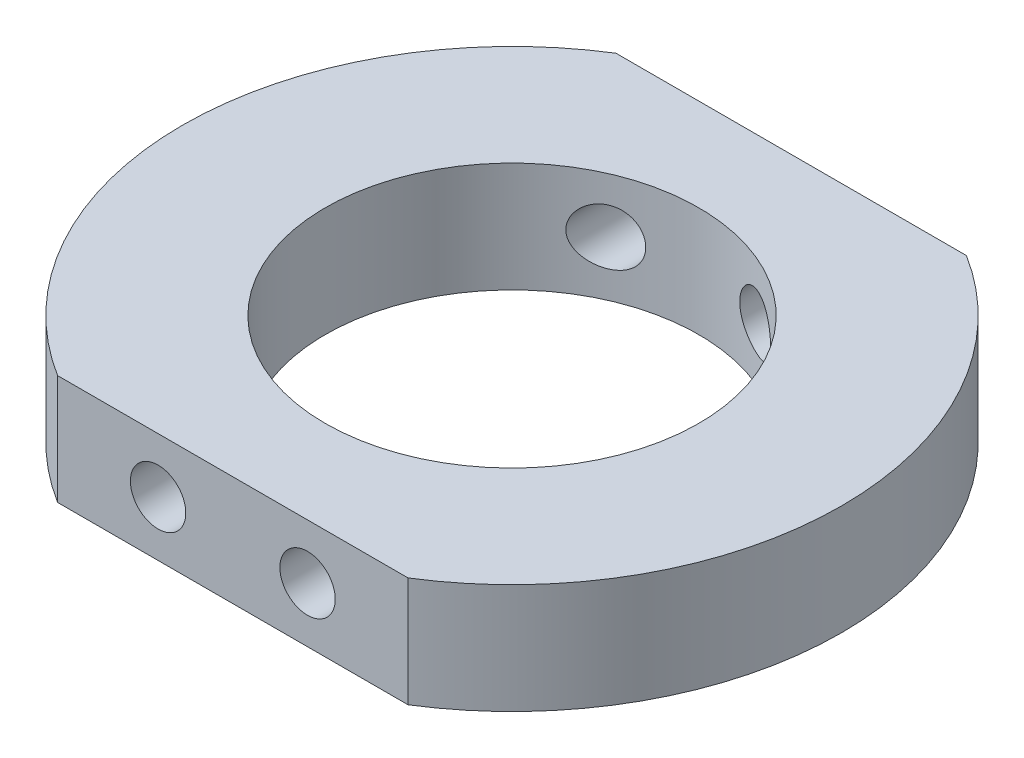
ISO-10303-21;
HEADER;
FILE_DESCRIPTION(('STEP AP214'),'2;1');
FILE_NAME('part.step','',(''),(''),'','','');
FILE_SCHEMA(('AUTOMOTIVE_DESIGN { 1 0 10303 214 1 1 1 1 }'));
ENDSEC;
DATA;
#1=APPLICATION_CONTEXT('core data for automotive mechanical design processes');
#2=APPLICATION_PROTOCOL_DEFINITION('international standard','automotive_design',2000,#1);
#3=PRODUCT_CONTEXT('',#1,'mechanical');
#4=PRODUCT('Part','Part','',(#3));
#5=PRODUCT_RELATED_PRODUCT_CATEGORY('part','',(#4));
#6=PRODUCT_DEFINITION_FORMATION('','',#4);
#7=PRODUCT_DEFINITION_CONTEXT('part definition',#1,'design');
#8=PRODUCT_DEFINITION('design','',#6,#7);
#9=PRODUCT_DEFINITION_SHAPE('','',#8);
#10=(LENGTH_UNIT() NAMED_UNIT(*) SI_UNIT(.MILLI.,.METRE.));
#11=(NAMED_UNIT(*) PLANE_ANGLE_UNIT() SI_UNIT($,.RADIAN.));
#12=(NAMED_UNIT(*) SI_UNIT($,.STERADIAN.) SOLID_ANGLE_UNIT());
#13=UNCERTAINTY_MEASURE_WITH_UNIT(LENGTH_MEASURE(1.E-05),#10,'distance_accuracy_value','');
#14=(GEOMETRIC_REPRESENTATION_CONTEXT(3) GLOBAL_UNCERTAINTY_ASSIGNED_CONTEXT((#13)) GLOBAL_UNIT_ASSIGNED_CONTEXT((#10,
#11,#12)) REPRESENTATION_CONTEXT('',''));
#15=CARTESIAN_POINT('',(0.,0.,0.));
#16=DIRECTION('',(0.,0.,1.));
#17=DIRECTION('',(1.,0.,0.));
#18=AXIS2_PLACEMENT_3D('',#15,#16,#17);
#19=CARTESIAN_POINT('',(0.,-12.7,0.));
#20=DIRECTION('',(0.,1.,0.));
#21=DIRECTION('',(0.,0.,1.));
#22=AXIS2_PLACEMENT_3D('',#19,#20,#21);
#23=CYLINDRICAL_SURFACE('',#22,38.1);
#24=DIRECTION('',(0.,-1.,0.));
#25=VECTOR('',#24,1.);
#26=CARTESIAN_POINT('',(-20.2570864044653,130.620306710814,32.26856752944));
#27=LINE('',#26,#25);
#28=CARTESIAN_POINT('',(-20.2570864044653,0.,32.26856752944));
#29=VERTEX_POINT('',#28);
#30=CARTESIAN_POINT('',(-20.2570864044653,-12.7,32.26856752944));
#31=VERTEX_POINT('',#30);
#32=EDGE_CURVE('E93',#29,#31,#27,.T.);
#33=ORIENTED_EDGE('',*,*,#32,.F.);
#34=CARTESIAN_POINT('',(0.,0.,0.));
#35=DIRECTION('',(0.,1.,0.));
#36=DIRECTION('',(0.,0.,1.));
#37=AXIS2_PLACEMENT_3D('',#34,#35,#36);
#38=CIRCLE('',#37,38.1);
#39=CARTESIAN_POINT('',(-20.2570864044653,0.,-32.26856752944));
#40=VERTEX_POINT('',#39);
#41=EDGE_CURVE('E82',#40,#29,#38,.T.);
#42=ORIENTED_EDGE('',*,*,#41,.F.);
#43=DIRECTION('',(0.,-1.,0.));
#44=VECTOR('',#43,1.);
#45=CARTESIAN_POINT('',(-20.2570864044653,151.511059456916,-32.26856752944));
#46=LINE('',#45,#44);
#47=CARTESIAN_POINT('',(-20.2570864044653,-12.7,-32.26856752944));
#48=VERTEX_POINT('',#47);
#49=EDGE_CURVE('E100',#40,#48,#46,.T.);
#50=ORIENTED_EDGE('',*,*,#49,.T.);
#51=CARTESIAN_POINT('',(0.,-12.7,0.));
#52=DIRECTION('',(0.,1.,0.));
#53=DIRECTION('',(0.,0.,1.));
#54=AXIS2_PLACEMENT_3D('',#51,#52,#53);
#55=CIRCLE('',#54,38.1);
#56=EDGE_CURVE('E94',#48,#31,#55,.T.);
#57=ORIENTED_EDGE('',*,*,#56,.T.);
#58=EDGE_LOOP('',(#33,#42,#50,#57));
#59=FACE_BOUND('',#58,.T.);
#60=ADVANCED_FACE('F33',(#59),#23,.T.);
#61=DIRECTION('',(0.,-1.,0.));
#62=VECTOR('',#61,1.);
#63=CARTESIAN_POINT('',(20.2570864044653,130.620306710814,32.26856752944));
#64=LINE('',#63,#62);
#65=CARTESIAN_POINT('',(20.2570864044653,0.,32.26856752944));
#66=VERTEX_POINT('',#65);
#67=CARTESIAN_POINT('',(20.2570864044653,-12.7,32.26856752944));
#68=VERTEX_POINT('',#67);
#69=EDGE_CURVE('E54',#66,#68,#64,.T.);
#70=ORIENTED_EDGE('',*,*,#69,.T.);
#71=CARTESIAN_POINT('',(20.2570864044653,-12.7,-32.26856752944));
#72=VERTEX_POINT('',#71);
#73=EDGE_CURVE('E89',#68,#72,#55,.T.);
#74=ORIENTED_EDGE('',*,*,#73,.T.);
#75=DIRECTION('',(0.,-1.,0.));
#76=VECTOR('',#75,1.);
#77=CARTESIAN_POINT('',(20.2570864044653,151.511059456916,-32.26856752944));
#78=LINE('',#77,#76);
#79=CARTESIAN_POINT('',(20.2570864044653,0.,-32.26856752944));
#80=VERTEX_POINT('',#79);
#81=EDGE_CURVE('E106',#80,#72,#78,.T.);
#82=ORIENTED_EDGE('',*,*,#81,.F.);
#83=EDGE_CURVE('E90',#66,#80,#38,.T.);
#84=ORIENTED_EDGE('',*,*,#83,.F.);
#85=EDGE_LOOP('',(#70,#74,#82,#84));
#86=FACE_BOUND('',#85,.T.);
#87=ADVANCED_FACE('F35',(#86),#23,.T.);
#88=CARTESIAN_POINT('',(0.,-12.7,0.));
#89=DIRECTION('',(0.,1.,0.));
#90=DIRECTION('',(0.,0.,1.));
#91=AXIS2_PLACEMENT_3D('',#88,#89,#90);
#92=PLANE('',#91);
#93=CARTESIAN_POINT('',(0.,-12.7,0.));
#94=DIRECTION('',(0.,1.,0.));
#95=DIRECTION('',(0.,0.,1.));
#96=AXIS2_PLACEMENT_3D('',#93,#94,#95);
#97=CIRCLE('',#96,21.59);
#98=CARTESIAN_POINT('',(0.,-12.7,21.59));
#99=VERTEX_POINT('',#98);
#100=EDGE_CURVE('E113',#99,#99,#97,.T.);
#101=ORIENTED_EDGE('',*,*,#100,.T.);
#102=EDGE_LOOP('',(#101));
#103=FACE_BOUND('',#102,.T.);
#104=ORIENTED_EDGE('',*,*,#73,.F.);
#105=DIRECTION('',(-1.,0.,0.));
#106=VECTOR('',#105,1.);
#107=CARTESIAN_POINT('',(0.,-12.7,32.26856752944));
#108=LINE('',#107,#106);
#109=EDGE_CURVE('E61',#68,#31,#108,.T.);
#110=ORIENTED_EDGE('',*,*,#109,.T.);
#111=ORIENTED_EDGE('',*,*,#56,.F.);
#112=DIRECTION('',(-1.,0.,0.));
#113=VECTOR('',#112,1.);
#114=CARTESIAN_POINT('',(0.,-12.7,-32.26856752944));
#115=LINE('',#114,#113);
#116=EDGE_CURVE('E109',#72,#48,#115,.T.);
#117=ORIENTED_EDGE('',*,*,#116,.F.);
#118=EDGE_LOOP('',(#104,#110,#111,#117));
#119=FACE_BOUND('',#118,.T.);
#120=ADVANCED_FACE('F157',(#103,#119),#92,.F.);
#121=CARTESIAN_POINT('',(0.,0.,0.));
#122=DIRECTION('',(0.,1.,0.));
#123=DIRECTION('',(0.,0.,1.));
#124=AXIS2_PLACEMENT_3D('',#121,#122,#123);
#125=PLANE('',#124);
#126=DIRECTION('',(-1.,0.,0.));
#127=VECTOR('',#126,1.);
#128=CARTESIAN_POINT('',(0.,0.,32.26856752944));
#129=LINE('',#128,#127);
#130=EDGE_CURVE('E11',#66,#29,#129,.T.);
#131=ORIENTED_EDGE('',*,*,#130,.F.);
#132=ORIENTED_EDGE('',*,*,#83,.T.);
#133=DIRECTION('',(-1.,0.,0.));
#134=VECTOR('',#133,1.);
#135=CARTESIAN_POINT('',(0.,0.,-32.26856752944));
#136=LINE('',#135,#134);
#137=EDGE_CURVE('E46',#80,#40,#136,.T.);
#138=ORIENTED_EDGE('',*,*,#137,.T.);
#139=ORIENTED_EDGE('',*,*,#41,.T.);
#140=EDGE_LOOP('',(#131,#132,#138,#139));
#141=FACE_BOUND('',#140,.T.);
#142=CARTESIAN_POINT('',(0.,0.,0.));
#143=DIRECTION('',(0.,1.,0.));
#144=DIRECTION('',(0.,0.,1.));
#145=AXIS2_PLACEMENT_3D('',#142,#143,#144);
#146=CIRCLE('',#145,21.59);
#147=CARTESIAN_POINT('',(0.,0.,21.59));
#148=VERTEX_POINT('',#147);
#149=EDGE_CURVE('E112',#148,#148,#146,.T.);
#150=ORIENTED_EDGE('',*,*,#149,.F.);
#151=EDGE_LOOP('',(#150));
#152=FACE_BOUND('',#151,.T.);
#153=ADVANCED_FACE('F84',(#141,#152),#125,.T.);
#154=CARTESIAN_POINT('',(0.,-12.7,0.));
#155=DIRECTION('',(0.,1.,0.));
#156=DIRECTION('',(0.,0.,1.));
#157=AXIS2_PLACEMENT_3D('',#154,#155,#156);
#158=CYLINDRICAL_SURFACE('',#157,21.59);
#159=CARTESIAN_POINT('',(5.43600000000001,-6.34999999999999,20.8944491193235));
#160=CARTESIAN_POINT('',(5.43600417780634,-6.52482596937976,20.8944491154701));
#161=CARTESIAN_POINT('',(5.45037366845655,-6.6997006480542,20.8907257060151));
#162=CARTESIAN_POINT('',(5.50738536340505,-7.04450288420994,20.8757670500161));
#163=CARTESIAN_POINT('',(5.55004079151525,-7.21442808898149,20.8645282899888));
#164=CARTESIAN_POINT('',(5.66214589768096,-7.54437317713616,20.8343838021955));
#165=CARTESIAN_POINT('',(5.73158131008773,-7.7043982817078,20.8154821561613));
#166=CARTESIAN_POINT('',(5.89487067879206,-8.01019748780447,20.7698279206782));
#167=CARTESIAN_POINT('',(5.98872226280105,-8.15597297193842,20.7430760939249));
#168=CARTESIAN_POINT('',(6.19849948868073,-8.4305462889237,20.6813614531156));
#169=CARTESIAN_POINT('',(6.31459251902632,-8.5592019665734,20.6463358727392));
#170=CARTESIAN_POINT('',(6.56448035010738,-8.7950639503519,20.5682474936521));
#171=CARTESIAN_POINT('',(6.69827678490989,-8.90226827417129,20.5251839528674));
#172=CARTESIAN_POINT('',(6.98333036662958,-9.09575991422694,20.4299871658724));
#173=CARTESIAN_POINT('',(7.13497741407984,-9.18136141365573,20.3776297743892));
#174=CARTESIAN_POINT('',(7.44775387775961,-9.32620553191144,20.2654058907837));
#175=CARTESIAN_POINT('',(7.60888539693771,-9.38544227988597,20.2055377299783));
#176=CARTESIAN_POINT('',(7.94499443792837,-9.47963256989106,20.0758389689565));
#177=CARTESIAN_POINT('',(8.12024868686611,-9.51309273914612,20.0056439136619));
#178=CARTESIAN_POINT('',(8.47146917439829,-9.55064957455914,19.8594698883063));
#179=CARTESIAN_POINT('',(8.64743563000311,-9.55473649095916,19.783489006233));
#180=CARTESIAN_POINT('',(9.00890120200095,-9.53372605557204,19.6216675944265));
#181=CARTESIAN_POINT('',(9.19413287605025,-9.5064300655315,19.5355143187991));
#182=CARTESIAN_POINT('',(9.55612779008722,-9.42050701733502,19.3610166962491));
#183=CARTESIAN_POINT('',(9.73288759597724,-9.36186736903497,19.2726714824746));
#184=CARTESIAN_POINT('',(10.0844372786669,-9.21022338525305,19.0911939329139));
#185=CARTESIAN_POINT('',(10.2584366956494,-9.11532654199217,18.9981015275552));
#186=CARTESIAN_POINT('',(10.587735293349,-8.89365590847077,18.8165717292371));
#187=CARTESIAN_POINT('',(10.7430245061968,-8.76686523684641,18.7281368315643));
#188=CARTESIAN_POINT('',(11.0279631507548,-8.48496070834382,18.5617612823802));
#189=CARTESIAN_POINT('',(11.1579154323967,-8.33023031218161,18.4837007544417));
#190=CARTESIAN_POINT('',(11.3308055492155,-8.07869652770348,18.3778551126074));
#191=CARTESIAN_POINT('',(11.384750903408,-7.99163845279961,18.3444549514799));
#192=CARTESIAN_POINT('',(11.4845953217266,-7.81153979538842,18.2821119535612));
#193=CARTESIAN_POINT('',(11.5304974814347,-7.71850153340119,18.253167402464));
#194=CARTESIAN_POINT('',(11.6329130764522,-7.482226949835,18.1881465521369));
#195=CARTESIAN_POINT('',(11.684332535183,-7.33588282284909,18.1550760816621));
#196=CARTESIAN_POINT('',(11.765678329395,-7.03509945748044,18.1024664500555));
#197=CARTESIAN_POINT('',(11.795621890485,-6.88066681375318,18.0829164447406));
#198=CARTESIAN_POINT('',(11.8325070416882,-6.5674141322516,18.0588035377497));
#199=CARTESIAN_POINT('',(11.8393809127862,-6.4085825552596,18.0542847592415));
#200=CARTESIAN_POINT('',(11.8295105936855,-6.09197057244107,18.0607533115446));
#201=CARTESIAN_POINT('',(11.8127646977574,-5.93419024335841,18.0717417622288));
#202=CARTESIAN_POINT('',(11.7579385756479,-5.63161997873859,18.1074560331308));
#203=CARTESIAN_POINT('',(11.7208686525018,-5.48656592682501,18.131530880309));
#204=CARTESIAN_POINT('',(11.6278900564448,-5.20520012244584,18.1912975717315));
#205=CARTESIAN_POINT('',(11.5719774484099,-5.06889020319717,18.2269918425341));
#206=CARTESIAN_POINT('',(11.4388922151172,-4.79818139539521,18.310828327537));
#207=CARTESIAN_POINT('',(11.3604890466551,-4.66461002915091,18.3596760379755));
#208=CARTESIAN_POINT('',(11.1872449467372,-4.41232071121577,18.4657512068329));
#209=CARTESIAN_POINT('',(11.092396133222,-4.29360992909252,18.5229826813675));
#210=CARTESIAN_POINT('',(10.8738944862463,-4.05620472782372,18.6522074482564));
#211=CARTESIAN_POINT('',(10.7480585338664,-3.9400289264887,18.725136810315));
#212=CARTESIAN_POINT('',(10.481351876958,-3.73016959824794,18.8757213401557));
#213=CARTESIAN_POINT('',(10.340472302794,-3.63649944749572,18.9533792841584));
#214=CARTESIAN_POINT('',(10.0272999306964,-3.46201168646769,19.1211097486895));
#215=CARTESIAN_POINT('',(9.85331172923941,-3.38449935632699,19.2114728866697));
#216=CARTESIAN_POINT('',(9.49402630644148,-3.26133083667146,19.3915439767138));
#217=CARTESIAN_POINT('',(9.30872490356916,-3.2156865045228,19.4812516726309));
#218=CARTESIAN_POINT('',(8.92266129675864,-3.1566242336165,19.6611682937924));
#219=CARTESIAN_POINT('',(8.72157928129248,-3.14476798846862,19.7512141185316));
#220=CARTESIAN_POINT('',(8.31787716572879,-3.15945813178383,19.9245886333873));
#221=CARTESIAN_POINT('',(8.115257443718,-3.18599536622722,20.0079189196651));
#222=CARTESIAN_POINT('',(7.72454482762245,-3.27630498157734,20.1618851071454));
#223=CARTESIAN_POINT('',(7.53621028832938,-3.33832972791751,20.232925894426));
#224=CARTESIAN_POINT('',(7.17144668539682,-3.4978707432832,20.3650694550607));
#225=CARTESIAN_POINT('',(6.99501123208472,-3.59536778129231,20.426177587402));
#226=CARTESIAN_POINT('',(6.67457281089339,-3.81475032223974,20.533010008017));
#227=CARTESIAN_POINT('',(6.52910843459815,-3.93409736428109,20.5795687176993));
#228=CARTESIAN_POINT('',(6.26005013874862,-4.19817532713636,20.66300422602));
#229=CARTESIAN_POINT('',(6.13645041628741,-4.34289949246416,20.6998835948284));
#230=CARTESIAN_POINT('',(5.92269620783175,-4.64411187169164,20.7620196750023));
#231=CARTESIAN_POINT('',(5.83098645847216,-4.79938335484911,20.787838471236));
#232=CARTESIAN_POINT('',(5.67468251817591,-5.12403122564159,20.8310512464887));
#233=CARTESIAN_POINT('',(5.61006939488896,-5.29339766567246,20.8484511091087));
#234=CARTESIAN_POINT('',(5.51911065791479,-5.61028011453921,20.8726927398643));
#235=CARTESIAN_POINT('',(5.48801425387791,-5.75635334242572,20.8808586577946));
#236=CARTESIAN_POINT('',(5.44645756752342,-6.05160597135345,20.8917367367189));
#237=CARTESIAN_POINT('',(5.43599643422341,-6.2007852440474,20.8944491226124));
#238=CARTESIAN_POINT('',(5.43600000000001,-6.34999999999999,20.8944491193235));
#239=B_SPLINE_CURVE_WITH_KNOTS('',3,(#159,#160,#161,#162,#163,#164,#165,#166,#167,#168,#169,
#170,#171,#172,#173,#174,#175,#176,#177,#178,#179,#180,#181,#182,#183,#184,#185,#186,#187,#188,
#189,#190,#191,#192,#193,#194,#195,#196,#197,#198,#199,#200,#201,#202,#203,#204,#205,#206,#207,
#208,#209,#210,#211,#212,#213,#214,#215,#216,#217,#218,#219,#220,#221,#222,#223,#224,#225,#226,
#227,#228,#229,#230,#231,#232,#233,#234,#235,#236,#237,#238),.UNSPECIFIED.,.T.,.F.,(4,2,2,2,2,2,
2,2,2,2,2,2,2,2,2,2,2,2,2,2,2,2,2,2,2,2,2,2,2,2,2,2,2,2,2,2,2,2,2,4),(0.,0.523938640379537,
1.04812239744396,1.57202730759138,2.09588133384991,2.62384482954108,3.15185709157869,
3.69496858232957,4.23820095167353,4.81093323916628,5.383855622847,5.99949393140518,
6.61537971606089,7.2691621966788,7.92329145438625,8.56904473793747,8.89174655910963,
9.21432390801494,9.68793103962874,10.1611578694342,10.6357726050331,11.1104216172495,
11.5633718935781,12.0164168231484,12.5017279414534,12.9872723056178,13.5435069135968,
14.1000713043413,14.7297556478627,15.3596741581025,16.0182695007998,16.6767078428461,
17.3052122052548,17.9333763355998,18.5118635251372,19.0901969523407,19.6340316164917,
20.1774856689801,20.6246881120286,21.0718721124132),.UNSPECIFIED.);
#240=CARTESIAN_POINT('',(5.43600000000001,-6.34999999999999,20.8944491193235));
#241=VERTEX_POINT('',#240);
#242=EDGE_CURVE('E37',#241,#241,#239,.T.);
#243=ORIENTED_EDGE('',*,*,#242,.T.);
#244=EDGE_LOOP('',(#243));
#245=FACE_BOUND('',#244,.T.);
#246=CARTESIAN_POINT('',(5.43600000000001,-6.34999999999999,-20.8944491193235));
#247=CARTESIAN_POINT('',(5.43600417780634,-6.17517403062023,-20.8944491154701));
#248=CARTESIAN_POINT('',(5.45037366845655,-6.00029935194579,-20.8907257060151));
#249=CARTESIAN_POINT('',(5.50738536340505,-5.65549711579005,-20.8757670500161));
#250=CARTESIAN_POINT('',(5.55004079151525,-5.4855719110185,-20.8645282899888));
#251=CARTESIAN_POINT('',(5.66214589768096,-5.15562682286383,-20.8343838021955));
#252=CARTESIAN_POINT('',(5.73158131008773,-4.99560171829219,-20.8154821561613));
#253=CARTESIAN_POINT('',(5.89487067879206,-4.68980251219552,-20.7698279206782));
#254=CARTESIAN_POINT('',(5.98872226280105,-4.54402702806157,-20.7430760939249));
#255=CARTESIAN_POINT('',(6.19849948868073,-4.2694537110763,-20.6813614531156));
#256=CARTESIAN_POINT('',(6.31459251902631,-4.14079803342659,-20.6463358727392));
#257=CARTESIAN_POINT('',(6.56448035010738,-3.90493604964809,-20.5682474936521));
#258=CARTESIAN_POINT('',(6.69827678490989,-3.7977317258287,-20.5251839528674));
#259=CARTESIAN_POINT('',(6.98333036662958,-3.60424008577305,-20.4299871658724));
#260=CARTESIAN_POINT('',(7.13497741407984,-3.51863858634426,-20.3776297743892));
#261=CARTESIAN_POINT('',(7.44775387775961,-3.37379446808855,-20.2654058907837));
#262=CARTESIAN_POINT('',(7.60888539693771,-3.31455772011402,-20.2055377299783));
#263=CARTESIAN_POINT('',(7.94499443792837,-3.22036743010893,-20.0758389689565));
#264=CARTESIAN_POINT('',(8.12024868686611,-3.18690726085387,-20.0056439136619));
#265=CARTESIAN_POINT('',(8.47146917439829,-3.14935042544085,-19.8594698883063));
#266=CARTESIAN_POINT('',(8.64743563000311,-3.14526350904082,-19.783489006233));
#267=CARTESIAN_POINT('',(9.00890120200094,-3.16627394442795,-19.6216675944265));
#268=CARTESIAN_POINT('',(9.19413287605025,-3.19356993446849,-19.5355143187991));
#269=CARTESIAN_POINT('',(9.55612779008722,-3.27949298266497,-19.3610166962491));
#270=CARTESIAN_POINT('',(9.73288759597724,-3.33813263096502,-19.2726714824746));
#271=CARTESIAN_POINT('',(10.0844372786669,-3.48977661474694,-19.0911939329139));
#272=CARTESIAN_POINT('',(10.2584366956494,-3.58467345800782,-18.9981015275552));
#273=CARTESIAN_POINT('',(10.587735293349,-3.80634409152922,-18.8165717292371));
#274=CARTESIAN_POINT('',(10.7430245061968,-3.93313476315358,-18.7281368315643));
#275=CARTESIAN_POINT('',(11.0279631507548,-4.21503929165617,-18.5617612823802));
#276=CARTESIAN_POINT('',(11.1579154323967,-4.36976968781839,-18.4837007544417));
#277=CARTESIAN_POINT('',(11.3308055492155,-4.62130347229651,-18.3778551126074));
#278=CARTESIAN_POINT('',(11.384750903408,-4.70836154720038,-18.3444549514799));
#279=CARTESIAN_POINT('',(11.4845953217266,-4.88846020461157,-18.2821119535612));
#280=CARTESIAN_POINT('',(11.5304974814347,-4.9814984665988,-18.253167402464));
#281=CARTESIAN_POINT('',(11.6329130764522,-5.21777305016499,-18.1881465521369));
#282=CARTESIAN_POINT('',(11.684332535183,-5.3641171771509,-18.1550760816621));
#283=CARTESIAN_POINT('',(11.765678329395,-5.66490054251954,-18.1024664500554));
#284=CARTESIAN_POINT('',(11.795621890485,-5.81933318624681,-18.0829164447406));
#285=CARTESIAN_POINT('',(11.8325070416882,-6.13258586774839,-18.0588035377497));
#286=CARTESIAN_POINT('',(11.8393809127862,-6.29141744474039,-18.0542847592415));
#287=CARTESIAN_POINT('',(11.8295105936855,-6.60802942755891,-18.0607533115446));
#288=CARTESIAN_POINT('',(11.8127646977574,-6.76580975664157,-18.0717417622288));
#289=CARTESIAN_POINT('',(11.7579385756479,-7.06838002126139,-18.1074560331308));
#290=CARTESIAN_POINT('',(11.7208686525018,-7.21343407317497,-18.131530880309));
#291=CARTESIAN_POINT('',(11.6278900564449,-7.49479987755415,-18.1912975717315));
#292=CARTESIAN_POINT('',(11.5719774484099,-7.63110979680281,-18.2269918425341));
#293=CARTESIAN_POINT('',(11.4388922151172,-7.90181860460478,-18.310828327537));
#294=CARTESIAN_POINT('',(11.3604890466551,-8.03538997084908,-18.3596760379755));
#295=CARTESIAN_POINT('',(11.1872449467372,-8.28767928878422,-18.4657512068328));
#296=CARTESIAN_POINT('',(11.092396133222,-8.40639007090746,-18.5229826813675));
#297=CARTESIAN_POINT('',(10.8738944862463,-8.64379527217627,-18.6522074482564));
#298=CARTESIAN_POINT('',(10.7480585338664,-8.75997107351129,-18.725136810315));
#299=CARTESIAN_POINT('',(10.481351876958,-8.96983040175204,-18.8757213401557));
#300=CARTESIAN_POINT('',(10.340472302794,-9.06350055250427,-18.9533792841584));
#301=CARTESIAN_POINT('',(10.0272999306964,-9.23798831353229,-19.1211097486895));
#302=CARTESIAN_POINT('',(9.85331172923942,-9.315500643673,-19.2114728866697));
#303=CARTESIAN_POINT('',(9.49402630644148,-9.43866916332853,-19.3915439767138));
#304=CARTESIAN_POINT('',(9.30872490356916,-9.48431349547719,-19.4812516726309));
#305=CARTESIAN_POINT('',(8.92266129675864,-9.54337576638349,-19.6611682937924));
#306=CARTESIAN_POINT('',(8.72157928129249,-9.55523201153136,-19.7512141185316));
#307=CARTESIAN_POINT('',(8.3178771657288,-9.54054186821616,-19.9245886333873));
#308=CARTESIAN_POINT('',(8.11525744371801,-9.51400463377277,-20.0079189196651));
#309=CARTESIAN_POINT('',(7.72454482762246,-9.42369501842265,-20.1618851071454));
#310=CARTESIAN_POINT('',(7.53621028832938,-9.36167027208249,-20.2329258944259));
#311=CARTESIAN_POINT('',(7.17144668539682,-9.20212925671679,-20.3650694550607));
#312=CARTESIAN_POINT('',(6.99501123208472,-9.10463221870768,-20.426177587402));
#313=CARTESIAN_POINT('',(6.67457281089339,-8.88524967776025,-20.533010008017));
#314=CARTESIAN_POINT('',(6.52910843459815,-8.7659026357189,-20.5795687176993));
#315=CARTESIAN_POINT('',(6.26005013874863,-8.50182467286363,-20.66300422602));
#316=CARTESIAN_POINT('',(6.13645041628741,-8.35710050753583,-20.6998835948284));
#317=CARTESIAN_POINT('',(5.92269620783175,-8.05588812830836,-20.7620196750023));
#318=CARTESIAN_POINT('',(5.83098645847216,-7.90061664515088,-20.787838471236));
#319=CARTESIAN_POINT('',(5.67468251817592,-7.57596877435841,-20.8310512464887));
#320=CARTESIAN_POINT('',(5.61006939488896,-7.40660233432754,-20.8484511091087));
#321=CARTESIAN_POINT('',(5.51911065791479,-7.08971988546078,-20.8726927398643));
#322=CARTESIAN_POINT('',(5.48801425387791,-6.94364665757427,-20.8808586577946));
#323=CARTESIAN_POINT('',(5.44645756752342,-6.64839402864654,-20.8917367367189));
#324=CARTESIAN_POINT('',(5.43599643422341,-6.49921475595259,-20.8944491226124));
#325=CARTESIAN_POINT('',(5.43600000000001,-6.34999999999999,-20.8944491193235));
#326=B_SPLINE_CURVE_WITH_KNOTS('',3,(#246,#247,#248,#249,#250,#251,#252,#253,#254,#255,#256,
#257,#258,#259,#260,#261,#262,#263,#264,#265,#266,#267,#268,#269,#270,#271,#272,#273,#274,#275,
#276,#277,#278,#279,#280,#281,#282,#283,#284,#285,#286,#287,#288,#289,#290,#291,#292,#293,#294,
#295,#296,#297,#298,#299,#300,#301,#302,#303,#304,#305,#306,#307,#308,#309,#310,#311,#312,#313,
#314,#315,#316,#317,#318,#319,#320,#321,#322,#323,#324,#325),.UNSPECIFIED.,.T.,.F.,(4,2,2,2,2,2,
2,2,2,2,2,2,2,2,2,2,2,2,2,2,2,2,2,2,2,2,2,2,2,2,2,2,2,2,2,2,2,2,2,4),(0.,0.523938640379537,
1.04812239744396,1.57202730759138,2.09588133384991,2.62384482954108,3.15185709157869,
3.69496858232957,4.23820095167353,4.81093323916628,5.383855622847,5.99949393140518,
6.61537971606089,7.2691621966788,7.92329145438625,8.56904473793747,8.89174655910963,
9.21432390801494,9.68793103962874,10.1611578694342,10.6357726050331,11.1104216172495,
11.5633718935781,12.0164168231484,12.5017279414534,12.9872723056178,13.5435069135968,
14.1000713043413,14.7297556478627,15.3596741581025,16.0182695007998,16.6767078428461,
17.3052122052548,17.9333763355998,18.5118635251372,19.0901969523407,19.6340316164917,
20.1774856689801,20.6246881120286,21.0718721124132),.UNSPECIFIED.);
#327=CARTESIAN_POINT('',(5.43600000000001,-6.34999999999999,-20.8944491193235));
#328=VERTEX_POINT('',#327);
#329=EDGE_CURVE('E231',#328,#328,#326,.T.);
#330=ORIENTED_EDGE('',*,*,#329,.T.);
#331=EDGE_LOOP('',(#330));
#332=FACE_BOUND('',#331,.T.);
#333=CARTESIAN_POINT('',(-11.836,-6.34999999999999,18.0565003253676));
#334=CARTESIAN_POINT('',(-11.8359938512523,-6.51021523871372,18.0565056388968));
#335=CARTESIAN_POINT('',(-11.8238980349944,-6.67048211929138,18.0644508495975));
#336=CARTESIAN_POINT('',(-11.7762268133523,-6.98598845611112,18.0955616931183));
#337=CARTESIAN_POINT('',(-11.7406355974221,-7.14122445312026,18.1187375749285));
#338=CARTESIAN_POINT('',(-11.6481200499072,-7.44167243178234,18.178349217521));
#339=CARTESIAN_POINT('',(-11.5912874155376,-7.58692436784113,18.2147279634983));
#340=CARTESIAN_POINT('',(-11.4587997104413,-7.86511290971792,18.2983639827414));
#341=CARTESIAN_POINT('',(-11.3831403221431,-7.99804668097971,18.3456237511847));
#342=CARTESIAN_POINT('',(-11.2093805881114,-8.25894406207678,18.4523442330167));
#343=CARTESIAN_POINT('',(-11.1100321275921,-8.38580799309854,18.5124498526255));
#344=CARTESIAN_POINT('',(-10.8955879796359,-8.6214928677968,18.6394691248413));
#345=CARTESIAN_POINT('',(-10.7804852371627,-8.7303056793082,18.7063858241047));
#346=CARTESIAN_POINT('',(-10.5185147603803,-8.94401275556963,18.8551029675669));
#347=CARTESIAN_POINT('',(-10.3694811040744,-9.0457637207952,18.9376146878487));
#348=CARTESIAN_POINT('',(-10.0575440989264,-9.22252291013627,19.1051118365195));
#349=CARTESIAN_POINT('',(-9.89463269000369,-9.29751546019553,19.1900986833238));
#350=CARTESIAN_POINT('',(-9.5420065486093,-9.42532736273305,19.3680363331701));
#351=CARTESIAN_POINT('',(-9.35122661667151,-9.47527603612312,19.4609566753858));
#352=CARTESIAN_POINT('',(-8.96203907187533,-9.53945006796475,19.6432208485031));
#353=CARTESIAN_POINT('',(-8.76363069876353,-9.55367185644266,19.7325643211117));
#354=CARTESIAN_POINT('',(-8.36499972256906,-9.54472210097311,19.9048223231193));
#355=CARTESIAN_POINT('',(-8.16477898466987,-9.5215854291116,19.987742772361));
#356=CARTESIAN_POINT('',(-7.76904316102593,-9.43695114805472,20.1448588362202));
#357=CARTESIAN_POINT('',(-7.57352599051351,-9.37547087186184,20.2190583750727));
#358=CARTESIAN_POINT('',(-7.20795533338304,-9.22007993879033,20.3521185016067));
#359=CARTESIAN_POINT('',(-7.03707651938534,-9.1287202024326,20.4116867494631));
#360=CARTESIAN_POINT('',(-6.71251292733221,-8.91474533468953,20.5207110559217));
#361=CARTESIAN_POINT('',(-6.55881999970042,-8.79214510880867,20.5701719167509));
#362=CARTESIAN_POINT('',(-6.28558094163934,-8.52917244311531,20.6552313290193));
#363=CARTESIAN_POINT('',(-6.16434678172549,-8.39079532930016,20.6915864464775));
#364=CARTESIAN_POINT('',(-5.94665282555428,-8.09392063923881,20.7551997807555));
#365=CARTESIAN_POINT('',(-5.85018622260694,-7.93542860896185,20.7824604975422));
#366=CARTESIAN_POINT('',(-5.68945036203576,-7.61063491910266,20.8270239858457));
#367=CARTESIAN_POINT('',(-5.62392621700106,-7.44500690890727,20.8447200933429));
#368=CARTESIAN_POINT('',(-5.52116172703682,-7.10457376295183,20.8721759413949));
#369=CARTESIAN_POINT('',(-5.48391784441475,-6.92976977797748,20.8819366746287));
#370=CARTESIAN_POINT('',(-5.43945297646903,-6.57950060488112,20.8935629627298));
#371=CARTESIAN_POINT('',(-5.43167804644623,-6.40411030845426,20.8955742013965));
#372=CARTESIAN_POINT('',(-5.44487611459374,-6.05449267130694,20.8921389405605));
#373=CARTESIAN_POINT('',(-5.46584773279659,-5.88026527516532,20.8866927990466));
#374=CARTESIAN_POINT('',(-5.53567048691228,-5.53869655289746,20.8682948915936));
#375=CARTESIAN_POINT('',(-5.58440056445311,-5.3713286868427,20.8553757128159));
#376=CARTESIAN_POINT('',(-5.70799625064698,-5.04736779298923,20.8218863640505));
#377=CARTESIAN_POINT('',(-5.78286155321963,-4.89077463902914,20.8013162836654));
#378=CARTESIAN_POINT('',(-5.9567068881187,-4.59174155319098,20.752202612695));
#379=CARTESIAN_POINT('',(-6.05582529414654,-4.44938968354729,20.7236131260861));
#380=CARTESIAN_POINT('',(-6.2745934208023,-4.18357522881259,20.6584261464574));
#381=CARTESIAN_POINT('',(-6.39424412548035,-4.06011354960721,20.6218282695969));
#382=CARTESIAN_POINT('',(-6.65277553008025,-3.83264678766696,20.5398976895702));
#383=CARTESIAN_POINT('',(-6.79199945410081,-3.72909123956025,20.4944016600262));
#384=CARTESIAN_POINT('',(-7.08323865183481,-3.54670295292117,20.3955747097086));
#385=CARTESIAN_POINT('',(-7.23525602998342,-3.4678742919125,20.3422424988566));
#386=CARTESIAN_POINT('',(-7.55441134836875,-3.33313598099461,20.2259493342127));
#387=CARTESIAN_POINT('',(-7.72192002925456,-3.27838301063391,20.1626686905946));
#388=CARTESIAN_POINT('',(-8.06109506891698,-3.19723557578643,20.0294802247272));
#389=CARTESIAN_POINT('',(-8.23276266468106,-3.17084965708967,19.9595704122888));
#390=CARTESIAN_POINT('',(-8.58772725477498,-3.14508593299471,19.8095593034267));
#391=CARTESIAN_POINT('',(-8.77101119554717,-3.14769265752637,19.7290877194282));
#392=CARTESIAN_POINT('',(-9.1327621604725,-3.18356630115511,19.5642615862606));
#393=CARTESIAN_POINT('',(-9.31122749414197,-3.2168438400788,19.4799057017572));
#394=CARTESIAN_POINT('',(-9.67201638486402,-3.31616207501441,19.3034547110077));
#395=CARTESIAN_POINT('',(-9.85367862270855,-3.3844069636365,19.2112425160687));
#396=CARTESIAN_POINT('',(-10.2024931097458,-3.55292110425999,19.0282969099693));
#397=CARTESIAN_POINT('',(-10.3696355682191,-3.65321175484832,18.9375645296281));
#398=CARTESIAN_POINT('',(-10.6886903333684,-3.88696658805859,18.7593760539689));
#399=CARTESIAN_POINT('',(-10.8401314558071,-4.02118056667733,18.6720539377393));
#400=CARTESIAN_POINT('',(-11.1174765228856,-4.31933802258063,18.5082614433827));
#401=CARTESIAN_POINT('',(-11.2434135335743,-4.48324247676444,18.4317770533198));
#402=CARTESIAN_POINT('',(-11.4373297050357,-4.79507134737697,18.3118916867866));
#403=CARTESIAN_POINT('',(-11.511969182219,-4.93751244796793,18.2649493662352));
#404=CARTESIAN_POINT('',(-11.6398113938867,-5.23500250777632,18.1837468546549));
#405=CARTESIAN_POINT('',(-11.6930462328106,-5.39003216264922,18.1494676767239));
#406=CARTESIAN_POINT('',(-11.7676982050593,-5.67889922142232,18.1011316962613));
#407=CARTESIAN_POINT('',(-11.7932111190453,-5.81125523704696,18.0844873945965));
#408=CARTESIAN_POINT('',(-11.8273645953892,-6.0790618631973,18.0621694760859));
#409=CARTESIAN_POINT('',(-11.8360051997467,-6.2145124660189,18.0564958319313));
#410=CARTESIAN_POINT('',(-11.836,-6.34999999999999,18.0565003253676));
#411=B_SPLINE_CURVE_WITH_KNOTS('',3,(#333,#334,#335,#336,#337,#338,#339,#340,#341,#342,#343,
#344,#345,#346,#347,#348,#349,#350,#351,#352,#353,#354,#355,#356,#357,#358,#359,#360,#361,#362,
#363,#364,#365,#366,#367,#368,#369,#370,#371,#372,#373,#374,#375,#376,#377,#378,#379,#380,#381,
#382,#383,#384,#385,#386,#387,#388,#389,#390,#391,#392,#393,#394,#395,#396,#397,#398,#399,#400,
#401,#402,#403,#404,#405,#406,#407,#408,#409,#410),.UNSPECIFIED.,.T.,.F.,(4,2,2,2,2,2,2,2,2,2,2,
2,2,2,2,2,2,2,2,2,2,2,2,2,2,2,2,2,2,2,2,2,2,2,2,2,2,2,4),(0.,0.480105620842282,
0.960534644576702,1.43891321602085,1.9174015961119,2.43137457825442,2.94557848395096,
3.53840808206319,4.13158436920464,4.78252914551001,5.43353896424187,6.08394145202209,
6.73405014204409,7.33897558067464,7.94361293512744,8.50335871536311,9.06295049962255,
9.59732847876399,10.1316395993822,10.6558556787267,11.1800465941527,11.7019687554847,
12.2238848045761,12.7488510219166,13.2738424063088,13.809570191154,14.3453862724258,
14.9046998176473,15.4641818131517,16.0621831136017,16.6603915509353,17.3020510246117,
17.9441398655614,18.6018972830664,19.2587963810388,19.759328497422,20.2591070486395,
20.6651139245378,21.0711197897764),.UNSPECIFIED.);
#412=CARTESIAN_POINT('',(-11.836,-6.34999999999999,18.0565003253676));
#413=VERTEX_POINT('',#412);
#414=EDGE_CURVE('E96',#413,#413,#411,.T.);
#415=ORIENTED_EDGE('',*,*,#414,.T.);
#416=EDGE_LOOP('',(#415));
#417=FACE_BOUND('',#416,.T.);
#418=CARTESIAN_POINT('',(-11.836,-6.34999999999999,-18.0565003253676));
#419=CARTESIAN_POINT('',(-11.8359938512523,-6.18978476128627,-18.0565056388968));
#420=CARTESIAN_POINT('',(-11.8238980349944,-6.02951788070861,-18.0644508495975));
#421=CARTESIAN_POINT('',(-11.7762268133523,-5.71401154388887,-18.0955616931183));
#422=CARTESIAN_POINT('',(-11.7406355974221,-5.55877554687973,-18.1187375749285));
#423=CARTESIAN_POINT('',(-11.6481200499072,-5.25832756821765,-18.178349217521));
#424=CARTESIAN_POINT('',(-11.5912874155376,-5.11307563215886,-18.2147279634983));
#425=CARTESIAN_POINT('',(-11.4587997104413,-4.83488709028207,-18.2983639827414));
#426=CARTESIAN_POINT('',(-11.3831403221431,-4.70195331902028,-18.3456237511847));
#427=CARTESIAN_POINT('',(-11.2093805881114,-4.44105593792321,-18.4523442330167));
#428=CARTESIAN_POINT('',(-11.1100321275921,-4.31419200690145,-18.5124498526255));
#429=CARTESIAN_POINT('',(-10.8955879796359,-4.07850713220319,-18.6394691248413));
#430=CARTESIAN_POINT('',(-10.7804852371627,-3.96969432069179,-18.7063858241047));
#431=CARTESIAN_POINT('',(-10.5185147603803,-3.75598724443036,-18.8551029675669));
#432=CARTESIAN_POINT('',(-10.3694811040744,-3.65423627920479,-18.9376146878487));
#433=CARTESIAN_POINT('',(-10.0575440989264,-3.47747708986372,-19.1051118365195));
#434=CARTESIAN_POINT('',(-9.89463269000369,-3.40248453980446,-19.1900986833238));
#435=CARTESIAN_POINT('',(-9.5420065486093,-3.27467263726694,-19.3680363331701));
#436=CARTESIAN_POINT('',(-9.35122661667151,-3.22472396387687,-19.4609566753858));
#437=CARTESIAN_POINT('',(-8.96203907187533,-3.16054993203524,-19.6432208485031));
#438=CARTESIAN_POINT('',(-8.76363069876353,-3.14632814355733,-19.7325643211117));
#439=CARTESIAN_POINT('',(-8.36499972256905,-3.15527789902688,-19.9048223231193));
#440=CARTESIAN_POINT('',(-8.16477898466987,-3.17841457088839,-19.987742772361));
#441=CARTESIAN_POINT('',(-7.76904316102593,-3.26304885194527,-20.1448588362202));
#442=CARTESIAN_POINT('',(-7.57352599051351,-3.32452912813815,-20.2190583750727));
#443=CARTESIAN_POINT('',(-7.20795533338304,-3.47992006120966,-20.3521185016067));
#444=CARTESIAN_POINT('',(-7.03707651938534,-3.57127979756739,-20.4116867494631));
#445=CARTESIAN_POINT('',(-6.71251292733221,-3.78525466531046,-20.5207110559217));
#446=CARTESIAN_POINT('',(-6.55881999970042,-3.90785489119132,-20.5701719167509));
#447=CARTESIAN_POINT('',(-6.28558094163934,-4.17082755688467,-20.6552313290193));
#448=CARTESIAN_POINT('',(-6.1643467817255,-4.30920467069983,-20.6915864464775));
#449=CARTESIAN_POINT('',(-5.94665282555428,-4.60607936076118,-20.7551997807555));
#450=CARTESIAN_POINT('',(-5.85018622260694,-4.76457139103814,-20.7824604975422));
#451=CARTESIAN_POINT('',(-5.68945036203576,-5.08936508089733,-20.8270239858457));
#452=CARTESIAN_POINT('',(-5.62392621700106,-5.25499309109272,-20.8447200933429));
#453=CARTESIAN_POINT('',(-5.52116172703682,-5.59542623704816,-20.8721759413949));
#454=CARTESIAN_POINT('',(-5.48391784441475,-5.77023022202251,-20.8819366746287));
#455=CARTESIAN_POINT('',(-5.43945297646903,-6.12049939511887,-20.8935629627298));
#456=CARTESIAN_POINT('',(-5.43167804644623,-6.29588969154573,-20.8955742013965));
#457=CARTESIAN_POINT('',(-5.44487611459374,-6.64550732869305,-20.8921389405605));
#458=CARTESIAN_POINT('',(-5.46584773279659,-6.81973472483467,-20.8866927990466));
#459=CARTESIAN_POINT('',(-5.53567048691228,-7.16130344710253,-20.8682948915936));
#460=CARTESIAN_POINT('',(-5.58440056445311,-7.32867131315729,-20.8553757128159));
#461=CARTESIAN_POINT('',(-5.70799625064698,-7.65263220701076,-20.8218863640505));
#462=CARTESIAN_POINT('',(-5.78286155321963,-7.80922536097085,-20.8013162836654));
#463=CARTESIAN_POINT('',(-5.9567068881187,-8.10825844680901,-20.752202612695));
#464=CARTESIAN_POINT('',(-6.05582529414654,-8.2506103164527,-20.7236131260861));
#465=CARTESIAN_POINT('',(-6.2745934208023,-8.5164247711874,-20.6584261464574));
#466=CARTESIAN_POINT('',(-6.39424412548035,-8.63988645039278,-20.6218282695969));
#467=CARTESIAN_POINT('',(-6.65277553008026,-8.86735321233303,-20.5398976895702));
#468=CARTESIAN_POINT('',(-6.79199945410082,-8.97090876043974,-20.4944016600262));
#469=CARTESIAN_POINT('',(-7.08323865183481,-9.15329704707882,-20.3955747097086));
#470=CARTESIAN_POINT('',(-7.23525602998342,-9.23212570808749,-20.3422424988566));
#471=CARTESIAN_POINT('',(-7.55441134836875,-9.36686401900538,-20.2259493342127));
#472=CARTESIAN_POINT('',(-7.72192002925456,-9.42161698936608,-20.1626686905946));
#473=CARTESIAN_POINT('',(-8.06109506891699,-9.50276442421356,-20.0294802247272));
#474=CARTESIAN_POINT('',(-8.23276266468107,-9.52915034291032,-19.9595704122888));
#475=CARTESIAN_POINT('',(-8.58772725477498,-9.55491406700527,-19.8095593034267));
#476=CARTESIAN_POINT('',(-8.77101119554717,-9.55230734247362,-19.7290877194282));
#477=CARTESIAN_POINT('',(-9.1327621604725,-9.51643369884488,-19.5642615862606));
#478=CARTESIAN_POINT('',(-9.31122749414197,-9.48315615992118,-19.4799057017572));
#479=CARTESIAN_POINT('',(-9.67201638486402,-9.38383792498558,-19.3034547110077));
#480=CARTESIAN_POINT('',(-9.85367862270855,-9.31559303636349,-19.2112425160687));
#481=CARTESIAN_POINT('',(-10.2024931097458,-9.14707889574,-19.0282969099693));
#482=CARTESIAN_POINT('',(-10.3696355682191,-9.04678824515167,-18.9375645296281));
#483=CARTESIAN_POINT('',(-10.6886903333684,-8.8130334119414,-18.7593760539689));
#484=CARTESIAN_POINT('',(-10.8401314558071,-8.67881943332266,-18.6720539377393));
#485=CARTESIAN_POINT('',(-11.1174765228856,-8.38066197741936,-18.5082614433827));
#486=CARTESIAN_POINT('',(-11.2434135335743,-8.21675752323554,-18.4317770533198));
#487=CARTESIAN_POINT('',(-11.4373297050357,-7.90492865262302,-18.3118916867866));
#488=CARTESIAN_POINT('',(-11.511969182219,-7.76248755203206,-18.2649493662352));
#489=CARTESIAN_POINT('',(-11.6398113938867,-7.46499749222366,-18.1837468546549));
#490=CARTESIAN_POINT('',(-11.6930462328106,-7.30996783735077,-18.1494676767239));
#491=CARTESIAN_POINT('',(-11.7676982050593,-7.02110077857767,-18.1011316962613));
#492=CARTESIAN_POINT('',(-11.7932111190453,-6.88874476295303,-18.0844873945965));
#493=CARTESIAN_POINT('',(-11.8273645953892,-6.62093813680269,-18.0621694760859));
#494=CARTESIAN_POINT('',(-11.8360051997467,-6.48548753398109,-18.0564958319313));
#495=CARTESIAN_POINT('',(-11.836,-6.34999999999999,-18.0565003253676));
#496=B_SPLINE_CURVE_WITH_KNOTS('',3,(#418,#419,#420,#421,#422,#423,#424,#425,#426,#427,#428,
#429,#430,#431,#432,#433,#434,#435,#436,#437,#438,#439,#440,#441,#442,#443,#444,#445,#446,#447,
#448,#449,#450,#451,#452,#453,#454,#455,#456,#457,#458,#459,#460,#461,#462,#463,#464,#465,#466,
#467,#468,#469,#470,#471,#472,#473,#474,#475,#476,#477,#478,#479,#480,#481,#482,#483,#484,#485,
#486,#487,#488,#489,#490,#491,#492,#493,#494,#495),.UNSPECIFIED.,.T.,.F.,(4,2,2,2,2,2,2,2,2,2,2,
2,2,2,2,2,2,2,2,2,2,2,2,2,2,2,2,2,2,2,2,2,2,2,2,2,2,2,4),(0.,0.480105620842282,
0.960534644576702,1.43891321602085,1.9174015961119,2.43137457825442,2.94557848395097,
3.53840808206319,4.13158436920464,4.78252914551001,5.43353896424187,6.08394145202209,
6.73405014204409,7.33897558067464,7.94361293512744,8.50335871536311,9.06295049962255,
9.597328478764,10.1316395993822,10.6558556787267,11.1800465941527,11.7019687554847,
12.2238848045761,12.7488510219166,13.2738424063088,13.809570191154,14.3453862724258,
14.9046998176473,15.4641818131517,16.0621831136017,16.6603915509353,17.3020510246117,
17.9441398655614,18.6018972830664,19.2587963810388,19.759328497422,20.2591070486395,
20.6651139245377,21.0711197897764),.UNSPECIFIED.);
#497=CARTESIAN_POINT('',(-11.836,-6.34999999999999,-18.0565003253676));
#498=VERTEX_POINT('',#497);
#499=EDGE_CURVE('E120',#498,#498,#496,.T.);
#500=ORIENTED_EDGE('',*,*,#499,.T.);
#501=EDGE_LOOP('',(#500));
#502=FACE_BOUND('',#501,.T.);
#503=ORIENTED_EDGE('',*,*,#100,.F.);
#504=EDGE_LOOP('',(#503));
#505=FACE_BOUND('',#504,.T.);
#506=ORIENTED_EDGE('',*,*,#149,.T.);
#507=EDGE_LOOP('',(#506));
#508=FACE_BOUND('',#507,.T.);
#509=ADVANCED_FACE('F128',(#245,#332,#417,#502,#505,#508),#158,.F.);
#510=CARTESIAN_POINT('',(-20.2570864044653,151.511059456916,-32.26856752944));
#511=DIRECTION('',(0.,0.,-1.));
#512=DIRECTION('',(-1.,0.,0.));
#513=AXIS2_PLACEMENT_3D('',#510,#511,#512);
#514=PLANE('',#513);
#515=CARTESIAN_POINT('',(8.636,-6.34999999999999,-32.26856752944));
#516=DIRECTION('',(0.,0.,-1.));
#517=DIRECTION('',(-1.,0.,0.));
#518=AXIS2_PLACEMENT_3D('',#515,#516,#517);
#519=CIRCLE('',#518,3.19999999999999);
#520=CARTESIAN_POINT('',(5.43600000000001,-6.34999999999999,-32.26856752944));
#521=VERTEX_POINT('',#520);
#522=EDGE_CURVE('E236',#521,#521,#519,.T.);
#523=ORIENTED_EDGE('',*,*,#522,.F.);
#524=EDGE_LOOP('',(#523));
#525=FACE_BOUND('',#524,.T.);
#526=CARTESIAN_POINT('',(-8.636,-6.34999999999999,-32.26856752944));
#527=DIRECTION('',(0.,0.,-1.));
#528=DIRECTION('',(-1.,0.,0.));
#529=AXIS2_PLACEMENT_3D('',#526,#527,#528);
#530=CIRCLE('',#529,3.19999999999999);
#531=CARTESIAN_POINT('',(-11.836,-6.34999999999999,-32.26856752944));
#532=VERTEX_POINT('',#531);
#533=EDGE_CURVE('E230',#532,#532,#530,.T.);
#534=ORIENTED_EDGE('',*,*,#533,.F.);
#535=EDGE_LOOP('',(#534));
#536=FACE_BOUND('',#535,.T.);
#537=ORIENTED_EDGE('',*,*,#81,.T.);
#538=ORIENTED_EDGE('',*,*,#116,.T.);
#539=ORIENTED_EDGE('',*,*,#49,.F.);
#540=ORIENTED_EDGE('',*,*,#137,.F.);
#541=EDGE_LOOP('',(#537,#538,#539,#540));
#542=FACE_BOUND('',#541,.T.);
#543=ADVANCED_FACE('F143',(#525,#536,#542),#514,.T.);
#544=CARTESIAN_POINT('',(-20.2570864044653,130.620306710814,32.26856752944));
#545=DIRECTION('',(0.,0.,-1.));
#546=DIRECTION('',(-1.,0.,0.));
#547=AXIS2_PLACEMENT_3D('',#544,#545,#546);
#548=PLANE('',#547);
#549=CARTESIAN_POINT('',(8.636,-6.34999999999999,32.26856752944));
#550=DIRECTION('',(0.,0.,-1.));
#551=DIRECTION('',(-1.,0.,0.));
#552=AXIS2_PLACEMENT_3D('',#549,#550,#551);
#553=CIRCLE('',#552,3.19999999999998);
#554=CARTESIAN_POINT('',(5.43600000000002,-6.34999999999999,32.26856752944));
#555=VERTEX_POINT('',#554);
#556=EDGE_CURVE('E227',#555,#555,#553,.T.);
#557=ORIENTED_EDGE('',*,*,#556,.T.);
#558=EDGE_LOOP('',(#557));
#559=FACE_BOUND('',#558,.T.);
#560=CARTESIAN_POINT('',(-8.636,-6.34999999999999,32.26856752944));
#561=DIRECTION('',(0.,0.,-1.));
#562=DIRECTION('',(-1.,0.,0.));
#563=AXIS2_PLACEMENT_3D('',#560,#561,#562);
#564=CIRCLE('',#563,3.19999999999998);
#565=CARTESIAN_POINT('',(-11.836,-6.34999999999999,32.26856752944));
#566=VERTEX_POINT('',#565);
#567=EDGE_CURVE('E103',#566,#566,#564,.T.);
#568=ORIENTED_EDGE('',*,*,#567,.T.);
#569=EDGE_LOOP('',(#568));
#570=FACE_BOUND('',#569,.T.);
#571=ORIENTED_EDGE('',*,*,#109,.F.);
#572=ORIENTED_EDGE('',*,*,#69,.F.);
#573=ORIENTED_EDGE('',*,*,#130,.T.);
#574=ORIENTED_EDGE('',*,*,#32,.T.);
#575=EDGE_LOOP('',(#571,#572,#573,#574));
#576=FACE_BOUND('',#575,.T.);
#577=ADVANCED_FACE('F98',(#559,#570,#576),#548,.F.);
#578=CARTESIAN_POINT('',(-8.636,-6.34999999999999,-32.26856752944));
#579=DIRECTION('',(0.,0.,-1.));
#580=DIRECTION('',(-1.,0.,0.));
#581=AXIS2_PLACEMENT_3D('',#578,#579,#580);
#582=CYLINDRICAL_SURFACE('',#581,3.19999999999999);
#583=ORIENTED_EDGE('',*,*,#533,.T.);
#584=EDGE_LOOP('',(#583));
#585=FACE_BOUND('',#584,.T.);
#586=ORIENTED_EDGE('',*,*,#499,.F.);
#587=EDGE_LOOP('',(#586));
#588=FACE_BOUND('',#587,.T.);
#589=ADVANCED_FACE('F137',(#585,#588),#582,.F.);
#590=ORIENTED_EDGE('',*,*,#567,.F.);
#591=EDGE_LOOP('',(#590));
#592=FACE_BOUND('',#591,.T.);
#593=ORIENTED_EDGE('',*,*,#414,.F.);
#594=EDGE_LOOP('',(#593));
#595=FACE_BOUND('',#594,.T.);
#596=ADVANCED_FACE('F132',(#592,#595),#582,.F.);
#597=CARTESIAN_POINT('',(8.636,-6.34999999999999,-32.26856752944));
#598=DIRECTION('',(0.,0.,-1.));
#599=DIRECTION('',(-1.,0.,0.));
#600=AXIS2_PLACEMENT_3D('',#597,#598,#599);
#601=CYLINDRICAL_SURFACE('',#600,3.19999999999999);
#602=ORIENTED_EDGE('',*,*,#522,.T.);
#603=EDGE_LOOP('',(#602));
#604=FACE_BOUND('',#603,.T.);
#605=ORIENTED_EDGE('',*,*,#329,.F.);
#606=EDGE_LOOP('',(#605));
#607=FACE_BOUND('',#606,.T.);
#608=ADVANCED_FACE('F136',(#604,#607),#601,.F.);
#609=ORIENTED_EDGE('',*,*,#556,.F.);
#610=EDGE_LOOP('',(#609));
#611=FACE_BOUND('',#610,.T.);
#612=ORIENTED_EDGE('',*,*,#242,.F.);
#613=EDGE_LOOP('',(#612));
#614=FACE_BOUND('',#613,.T.);
#615=ADVANCED_FACE('F139',(#611,#614),#601,.F.);
#616=CLOSED_SHELL('',(#60,#87,#120,#153,#509,#543,#577,#589,#596,#608,#615));
#617=MANIFOLD_SOLID_BREP('B2',#616);
#618=ADVANCED_BREP_SHAPE_REPRESENTATION('',(#18,#617),#14);
#619=SHAPE_DEFINITION_REPRESENTATION(#9,#618);
ENDSEC;
END-ISO-10303-21;
